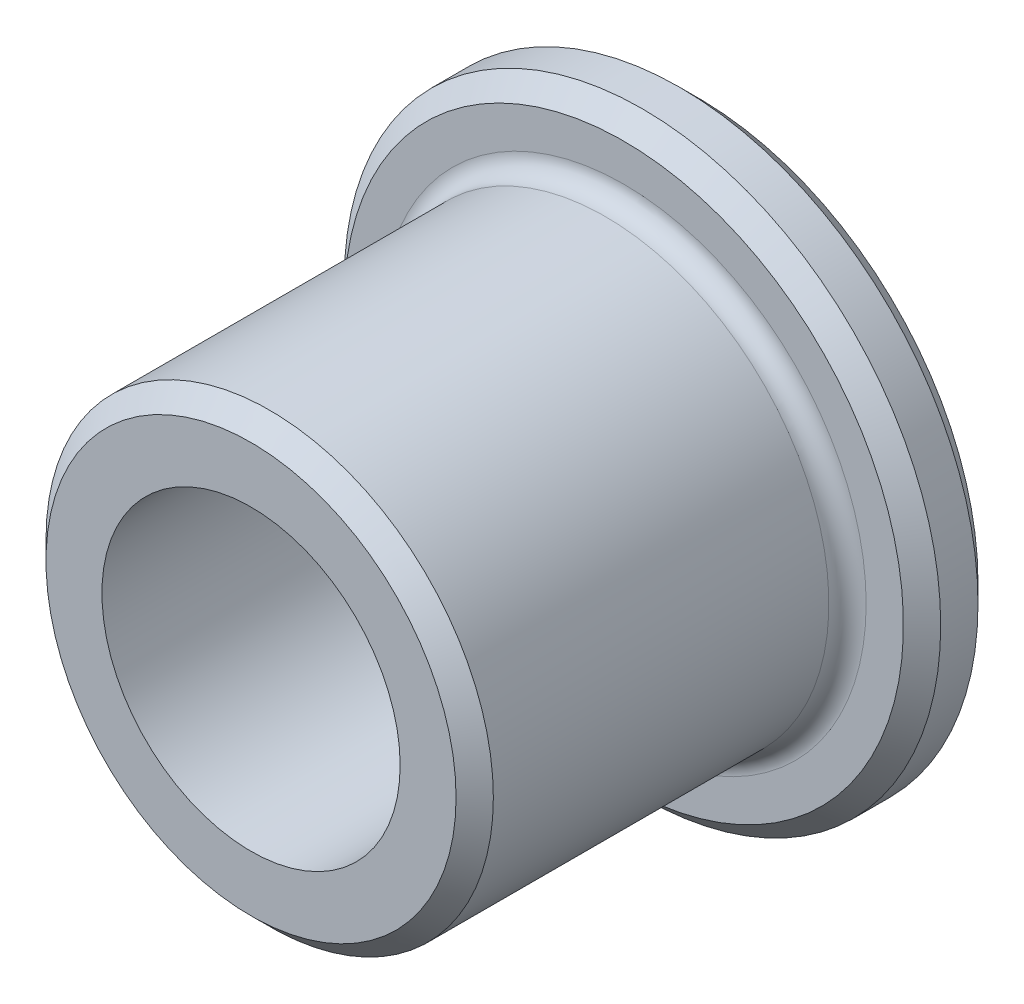
ISO-10303-21;
HEADER;
FILE_DESCRIPTION(('STEP AP214'),'2;1');
FILE_NAME('part.step','',(''),(''),'','','');
FILE_SCHEMA(('AUTOMOTIVE_DESIGN { 1 0 10303 214 1 1 1 1 }'));
ENDSEC;
DATA;
#1=APPLICATION_CONTEXT('core data for automotive mechanical design processes');
#2=APPLICATION_PROTOCOL_DEFINITION('international standard','automotive_design',2000,#1);
#3=PRODUCT_CONTEXT('',#1,'mechanical');
#4=PRODUCT('Part','Part','',(#3));
#5=PRODUCT_RELATED_PRODUCT_CATEGORY('part','',(#4));
#6=PRODUCT_DEFINITION_FORMATION('','',#4);
#7=PRODUCT_DEFINITION_CONTEXT('part definition',#1,'design');
#8=PRODUCT_DEFINITION('design','',#6,#7);
#9=PRODUCT_DEFINITION_SHAPE('','',#8);
#10=(LENGTH_UNIT() NAMED_UNIT(*) SI_UNIT(.MILLI.,.METRE.));
#11=(NAMED_UNIT(*) PLANE_ANGLE_UNIT() SI_UNIT($,.RADIAN.));
#12=(NAMED_UNIT(*) SI_UNIT($,.STERADIAN.) SOLID_ANGLE_UNIT());
#13=UNCERTAINTY_MEASURE_WITH_UNIT(LENGTH_MEASURE(1.E-05),#10,'distance_accuracy_value','');
#14=(GEOMETRIC_REPRESENTATION_CONTEXT(3) GLOBAL_UNCERTAINTY_ASSIGNED_CONTEXT((#13)) GLOBAL_UNIT_ASSIGNED_CONTEXT((#10,
#11,#12)) REPRESENTATION_CONTEXT('',''));
#15=CARTESIAN_POINT('',(0.,0.,0.));
#16=DIRECTION('',(0.,0.,1.));
#17=DIRECTION('',(1.,0.,0.));
#18=AXIS2_PLACEMENT_3D('',#15,#16,#17);
#19=CARTESIAN_POINT('',(0.,0.,12.));
#20=DIRECTION('',(0.,0.,-1.));
#21=DIRECTION('',(-1.,0.,0.));
#22=AXIS2_PLACEMENT_3D('',#19,#20,#21);
#23=CYLINDRICAL_SURFACE('',#22,6.);
#24=CARTESIAN_POINT('',(0.,0.,2.5));
#25=DIRECTION('',(0.,0.,-1.));
#26=DIRECTION('',(-1.,0.,0.));
#27=AXIS2_PLACEMENT_3D('',#24,#25,#26);
#28=CIRCLE('',#27,6.);
#29=CARTESIAN_POINT('',(-6.,0.,2.5));
#30=VERTEX_POINT('',#29);
#31=EDGE_CURVE('E10',#30,#30,#28,.F.);
#32=ORIENTED_EDGE('',*,*,#31,.T.);
#33=EDGE_LOOP('',(#32));
#34=FACE_BOUND('',#33,.T.);
#35=CARTESIAN_POINT('',(0.,0.,11.5));
#36=DIRECTION('',(0.,0.,1.));
#37=DIRECTION('',(1.,0.,0.));
#38=AXIS2_PLACEMENT_3D('',#35,#36,#37);
#39=CIRCLE('',#38,6.);
#40=CARTESIAN_POINT('',(6.,0.,11.5));
#41=VERTEX_POINT('',#40);
#42=EDGE_CURVE('E39',#41,#41,#39,.F.);
#43=ORIENTED_EDGE('',*,*,#42,.T.);
#44=EDGE_LOOP('',(#43));
#45=FACE_BOUND('',#44,.T.);
#46=ADVANCED_FACE('F28',(#34,#45),#23,.T.);
#47=CARTESIAN_POINT('',(0.,0.,12.));
#48=DIRECTION('',(0.,0.,1.));
#49=DIRECTION('',(1.,0.,0.));
#50=AXIS2_PLACEMENT_3D('',#47,#48,#49);
#51=PLANE('',#50);
#52=CARTESIAN_POINT('',(0.,0.,12.));
#53=DIRECTION('',(0.,0.,1.));
#54=DIRECTION('',(1.,0.,0.));
#55=AXIS2_PLACEMENT_3D('',#52,#53,#54);
#56=CIRCLE('',#55,5.5);
#57=CARTESIAN_POINT('',(5.5,0.,12.));
#58=VERTEX_POINT('',#57);
#59=EDGE_CURVE('E43',#58,#58,#56,.T.);
#60=ORIENTED_EDGE('',*,*,#59,.T.);
#61=EDGE_LOOP('',(#60));
#62=FACE_BOUND('',#61,.T.);
#63=CARTESIAN_POINT('',(0.,0.,12.));
#64=DIRECTION('',(0.,0.,1.));
#65=DIRECTION('',(1.,0.,0.));
#66=AXIS2_PLACEMENT_3D('',#63,#64,#65);
#67=CIRCLE('',#66,4.);
#68=CARTESIAN_POINT('',(4.,0.,12.));
#69=VERTEX_POINT('',#68);
#70=EDGE_CURVE('E61',#69,#69,#67,.T.);
#71=ORIENTED_EDGE('',*,*,#70,.F.);
#72=EDGE_LOOP('',(#71));
#73=FACE_BOUND('',#72,.T.);
#74=ADVANCED_FACE('F76',(#62,#73),#51,.T.);
#75=CARTESIAN_POINT('',(0.,0.,0.));
#76=DIRECTION('',(0.,0.,1.));
#77=DIRECTION('',(1.,0.,0.));
#78=AXIS2_PLACEMENT_3D('',#75,#76,#77);
#79=PLANE('',#78);
#80=CARTESIAN_POINT('',(0.,0.,0.));
#81=DIRECTION('',(0.,0.,1.));
#82=DIRECTION('',(1.,0.,0.));
#83=AXIS2_PLACEMENT_3D('',#80,#81,#82);
#84=CIRCLE('',#83,7.5);
#85=CARTESIAN_POINT('',(7.5,0.,0.));
#86=VERTEX_POINT('',#85);
#87=EDGE_CURVE('E57',#86,#86,#84,.F.);
#88=ORIENTED_EDGE('',*,*,#87,.T.);
#89=EDGE_LOOP('',(#88));
#90=FACE_BOUND('',#89,.T.);
#91=CARTESIAN_POINT('',(0.,0.,0.));
#92=DIRECTION('',(0.,0.,1.));
#93=DIRECTION('',(1.,0.,0.));
#94=AXIS2_PLACEMENT_3D('',#91,#92,#93);
#95=CIRCLE('',#94,4.);
#96=CARTESIAN_POINT('',(4.,0.,0.));
#97=VERTEX_POINT('',#96);
#98=EDGE_CURVE('E60',#97,#97,#95,.T.);
#99=ORIENTED_EDGE('',*,*,#98,.T.);
#100=EDGE_LOOP('',(#99));
#101=FACE_BOUND('',#100,.T.);
#102=ADVANCED_FACE('F67',(#90,#101),#79,.F.);
#103=CARTESIAN_POINT('',(0.,0.,0.));
#104=DIRECTION('',(0.,0.,1.));
#105=DIRECTION('',(1.,0.,0.));
#106=AXIS2_PLACEMENT_3D('',#103,#104,#105);
#107=CYLINDRICAL_SURFACE('',#106,4.);
#108=ORIENTED_EDGE('',*,*,#98,.F.);
#109=EDGE_LOOP('',(#108));
#110=FACE_BOUND('',#109,.T.);
#111=ORIENTED_EDGE('',*,*,#70,.T.);
#112=EDGE_LOOP('',(#111));
#113=FACE_BOUND('',#112,.T.);
#114=ADVANCED_FACE('F69',(#110,#113),#107,.F.);
#115=CARTESIAN_POINT('',(-5.30134054943678,0.,2.));
#116=DIRECTION('',(0.,0.,-1.));
#117=DIRECTION('',(-1.,0.,0.));
#118=AXIS2_PLACEMENT_3D('',#115,#116,#117);
#119=PLANE('',#118);
#120=CARTESIAN_POINT('',(0.,0.,2.));
#121=DIRECTION('',(0.,0.,-1.));
#122=DIRECTION('',(-1.,0.,0.));
#123=AXIS2_PLACEMENT_3D('',#120,#121,#122);
#124=CIRCLE('',#123,6.5);
#125=CARTESIAN_POINT('',(-6.5,0.,2.));
#126=VERTEX_POINT('',#125);
#127=EDGE_CURVE('E35',#126,#126,#124,.T.);
#128=ORIENTED_EDGE('',*,*,#127,.T.);
#129=EDGE_LOOP('',(#128));
#130=FACE_BOUND('',#129,.T.);
#131=CARTESIAN_POINT('',(0.,0.,2.));
#132=DIRECTION('',(0.,0.,-1.));
#133=DIRECTION('',(-1.,0.,0.));
#134=AXIS2_PLACEMENT_3D('',#131,#132,#133);
#135=CIRCLE('',#134,7.49999999999999);
#136=CARTESIAN_POINT('',(-7.49999999999999,0.,2.));
#137=VERTEX_POINT('',#136);
#138=EDGE_CURVE('E48',#137,#137,#135,.F.);
#139=ORIENTED_EDGE('',*,*,#138,.T.);
#140=EDGE_LOOP('',(#139));
#141=FACE_BOUND('',#140,.T.);
#142=ADVANCED_FACE('F72',(#130,#141),#119,.F.);
#143=CARTESIAN_POINT('',(0.,0.,-1.45637409576693));
#144=DIRECTION('',(0.,0.,-1.));
#145=DIRECTION('',(-1.,0.,0.));
#146=AXIS2_PLACEMENT_3D('',#143,#144,#145);
#147=CYLINDRICAL_SURFACE('',#146,8.);
#148=CARTESIAN_POINT('',(0.,0.,0.500000000000007));
#149=DIRECTION('',(0.,0.,1.));
#150=DIRECTION('',(1.,0.,0.));
#151=AXIS2_PLACEMENT_3D('',#148,#149,#150);
#152=CIRCLE('',#151,8.);
#153=CARTESIAN_POINT('',(8.,0.,0.500000000000007));
#154=VERTEX_POINT('',#153);
#155=EDGE_CURVE('E51',#154,#154,#152,.T.);
#156=ORIENTED_EDGE('',*,*,#155,.T.);
#157=EDGE_LOOP('',(#156));
#158=FACE_BOUND('',#157,.T.);
#159=CARTESIAN_POINT('',(0.,0.,1.5));
#160=DIRECTION('',(0.,0.,-1.));
#161=DIRECTION('',(-1.,0.,0.));
#162=AXIS2_PLACEMENT_3D('',#159,#160,#161);
#163=CIRCLE('',#162,8.);
#164=CARTESIAN_POINT('',(-8.,0.,1.5));
#165=VERTEX_POINT('',#164);
#166=EDGE_CURVE('E54',#165,#165,#163,.T.);
#167=ORIENTED_EDGE('',*,*,#166,.T.);
#168=EDGE_LOOP('',(#167));
#169=FACE_BOUND('',#168,.T.);
#170=ADVANCED_FACE('F93',(#158,#169),#147,.T.);
#171=CARTESIAN_POINT('',(0.,0.,0.));
#172=DIRECTION('',(0.,0.,1.));
#173=DIRECTION('',(1.,0.,0.));
#174=AXIS2_PLACEMENT_3D('',#171,#172,#173);
#175=CONICAL_SURFACE('',#174,7.5,0.785398163397445);
#176=ORIENTED_EDGE('',*,*,#155,.F.);
#177=EDGE_LOOP('',(#176));
#178=FACE_BOUND('',#177,.T.);
#179=ORIENTED_EDGE('',*,*,#87,.F.);
#180=EDGE_LOOP('',(#179));
#181=FACE_BOUND('',#180,.T.);
#182=ADVANCED_FACE('F89',(#178,#181),#175,.T.);
#183=CARTESIAN_POINT('',(0.,0.,1.5));
#184=DIRECTION('',(0.,0.,-1.));
#185=DIRECTION('',(-1.,0.,0.));
#186=AXIS2_PLACEMENT_3D('',#183,#184,#185);
#187=CONICAL_SURFACE('',#186,8.,0.785398163397452);
#188=ORIENTED_EDGE('',*,*,#138,.F.);
#189=EDGE_LOOP('',(#188));
#190=FACE_BOUND('',#189,.T.);
#191=ORIENTED_EDGE('',*,*,#166,.F.);
#192=EDGE_LOOP('',(#191));
#193=FACE_BOUND('',#192,.T.);
#194=ADVANCED_FACE('F92',(#190,#193),#187,.T.);
#195=CARTESIAN_POINT('',(0.,0.,12.));
#196=DIRECTION('',(0.,0.,-1.));
#197=DIRECTION('',(-1.,0.,0.));
#198=AXIS2_PLACEMENT_3D('',#195,#196,#197);
#199=CONICAL_SURFACE('',#198,5.5,0.785398163397445);
#200=ORIENTED_EDGE('',*,*,#42,.F.);
#201=EDGE_LOOP('',(#200));
#202=FACE_BOUND('',#201,.T.);
#203=ORIENTED_EDGE('',*,*,#59,.F.);
#204=EDGE_LOOP('',(#203));
#205=FACE_BOUND('',#204,.T.);
#206=ADVANCED_FACE('F96',(#202,#205),#199,.T.);
#207=CARTESIAN_POINT('',(0.,0.,2.5));
#208=DIRECTION('',(0.,0.,-1.));
#209=DIRECTION('',(-1.,0.,0.));
#210=AXIS2_PLACEMENT_3D('',#207,#208,#209);
#211=TOROIDAL_SURFACE('',#210,6.5,0.5);
#212=ORIENTED_EDGE('',*,*,#31,.F.);
#213=EDGE_LOOP('',(#212));
#214=FACE_BOUND('',#213,.T.);
#215=ORIENTED_EDGE('',*,*,#127,.F.);
#216=EDGE_LOOP('',(#215));
#217=FACE_BOUND('',#216,.T.);
#218=ADVANCED_FACE('F30',(#214,#217),#211,.F.);
#219=CLOSED_SHELL('',(#46,#74,#102,#114,#142,#170,#182,#194,#206,#218));
#220=MANIFOLD_SOLID_BREP('B2',#219);
#221=ADVANCED_BREP_SHAPE_REPRESENTATION('',(#18,#220),#14);
#222=SHAPE_DEFINITION_REPRESENTATION(#9,#221);
ENDSEC;
END-ISO-10303-21;
